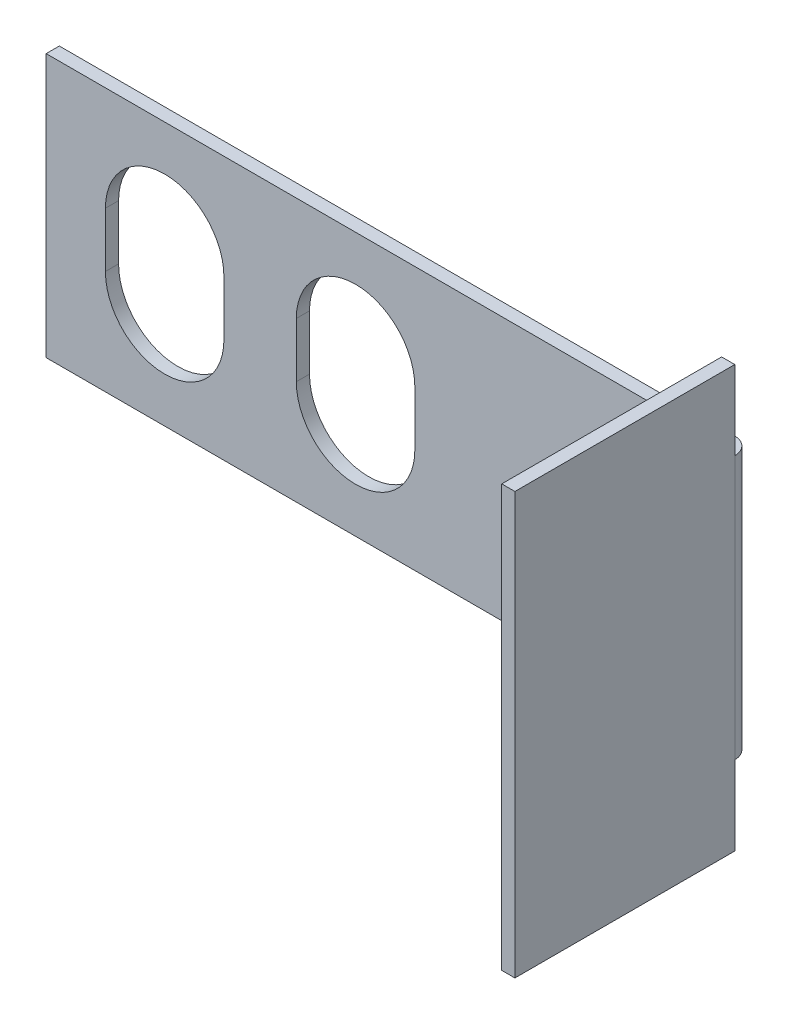
ISO-10303-21;
HEADER;
FILE_DESCRIPTION(('STEP AP214'),'2;1');
FILE_NAME('part.step','',(''),(''),'','','');
FILE_SCHEMA(('AUTOMOTIVE_DESIGN { 1 0 10303 214 1 1 1 1 }'));
ENDSEC;
DATA;
#1=APPLICATION_CONTEXT('core data for automotive mechanical design processes');
#2=APPLICATION_PROTOCOL_DEFINITION('international standard','automotive_design',2000,#1);
#3=PRODUCT_CONTEXT('',#1,'mechanical');
#4=PRODUCT('Part','Part','',(#3));
#5=PRODUCT_RELATED_PRODUCT_CATEGORY('part','',(#4));
#6=PRODUCT_DEFINITION_FORMATION('','',#4);
#7=PRODUCT_DEFINITION_CONTEXT('part definition',#1,'design');
#8=PRODUCT_DEFINITION('design','',#6,#7);
#9=PRODUCT_DEFINITION_SHAPE('','',#8);
#10=(LENGTH_UNIT() NAMED_UNIT(*) SI_UNIT(.MILLI.,.METRE.));
#11=(NAMED_UNIT(*) PLANE_ANGLE_UNIT() SI_UNIT($,.RADIAN.));
#12=(NAMED_UNIT(*) SI_UNIT($,.STERADIAN.) SOLID_ANGLE_UNIT());
#13=UNCERTAINTY_MEASURE_WITH_UNIT(LENGTH_MEASURE(1.E-05),#10,'distance_accuracy_value','');
#14=(GEOMETRIC_REPRESENTATION_CONTEXT(3) GLOBAL_UNCERTAINTY_ASSIGNED_CONTEXT((#13)) GLOBAL_UNIT_ASSIGNED_CONTEXT((#10,
#11,#12)) REPRESENTATION_CONTEXT('',''));
#15=CARTESIAN_POINT('',(0.,0.,0.));
#16=DIRECTION('',(0.,0.,1.));
#17=DIRECTION('',(1.,0.,0.));
#18=AXIS2_PLACEMENT_3D('',#15,#16,#17);
#19=CARTESIAN_POINT('',(0.,5.,-0.5));
#20=DIRECTION('',(0.,1.,0.));
#21=DIRECTION('',(0.,0.,1.));
#22=AXIS2_PLACEMENT_3D('',#19,#20,#21);
#23=PLANE('',#22);
#24=DIRECTION('',(-1.,0.,0.));
#25=VECTOR('',#24,1.);
#26=CARTESIAN_POINT('',(0.,5.,0.));
#27=LINE('',#26,#25);
#28=CARTESIAN_POINT('',(25.65,5.,0.));
#29=VERTEX_POINT('',#28);
#30=CARTESIAN_POINT('',(0.,5.,0.));
#31=VERTEX_POINT('',#30);
#32=EDGE_CURVE('E485',#29,#31,#27,.T.);
#33=ORIENTED_EDGE('',*,*,#32,.F.);
#34=DIRECTION('',(0.,0.,-1.));
#35=VECTOR('',#34,1.);
#36=CARTESIAN_POINT('',(25.65,5.,0.));
#37=LINE('',#36,#35);
#38=CARTESIAN_POINT('',(25.65,5.,-0.500000000000003));
#39=VERTEX_POINT('',#38);
#40=EDGE_CURVE('E455',#29,#39,#37,.T.);
#41=ORIENTED_EDGE('',*,*,#40,.T.);
#42=DIRECTION('',(-1.,0.,0.));
#43=VECTOR('',#42,1.);
#44=CARTESIAN_POINT('',(0.,5.,-0.5));
#45=LINE('',#44,#43);
#46=CARTESIAN_POINT('',(0.,5.,-0.5));
#47=VERTEX_POINT('',#46);
#48=EDGE_CURVE('E488',#39,#47,#45,.T.);
#49=ORIENTED_EDGE('',*,*,#48,.T.);
#50=DIRECTION('',(0.,0.,1.));
#51=VECTOR('',#50,1.);
#52=CARTESIAN_POINT('',(0.,5.,-0.5));
#53=LINE('',#52,#51);
#54=EDGE_CURVE('E14',#47,#31,#53,.T.);
#55=ORIENTED_EDGE('',*,*,#54,.T.);
#56=EDGE_LOOP('',(#33,#41,#49,#55));
#57=FACE_BOUND('',#56,.T.);
#58=ADVANCED_FACE('F210',(#57),#23,.T.);
#59=CARTESIAN_POINT('',(0.,0.,-0.5));
#60=DIRECTION('',(0.,0.,-1.));
#61=DIRECTION('',(-1.,0.,0.));
#62=AXIS2_PLACEMENT_3D('',#59,#60,#61);
#63=PLANE('',#62);
#64=CARTESIAN_POINT('',(4.5,1.04009988451317,-0.500000000000003));
#65=DIRECTION('',(0.,0.,1.));
#66=DIRECTION('',(1.,0.,0.));
#67=AXIS2_PLACEMENT_3D('',#64,#65,#66);
#68=CIRCLE('',#67,2.25);
#69=CARTESIAN_POINT('',(6.75,1.04009988451317,-0.500000000000002));
#70=VERTEX_POINT('',#69);
#71=CARTESIAN_POINT('',(2.25,1.04009988451317,-0.500000000000003));
#72=VERTEX_POINT('',#71);
#73=EDGE_CURVE('E368',#70,#72,#68,.T.);
#74=ORIENTED_EDGE('',*,*,#73,.T.);
#75=DIRECTION('',(0.,1.,0.));
#76=VECTOR('',#75,1.);
#77=CARTESIAN_POINT('',(2.25,-1.04009988451317,-0.500000000000003));
#78=LINE('',#77,#76);
#79=CARTESIAN_POINT('',(2.25,-1.04009988451317,-0.500000000000002));
#80=VERTEX_POINT('',#79);
#81=EDGE_CURVE('E349',#80,#72,#78,.T.);
#82=ORIENTED_EDGE('',*,*,#81,.F.);
#83=CARTESIAN_POINT('',(4.5,-1.04009988451317,-0.500000000000003));
#84=DIRECTION('',(0.,0.,1.));
#85=DIRECTION('',(1.,0.,0.));
#86=AXIS2_PLACEMENT_3D('',#83,#84,#85);
#87=CIRCLE('',#86,2.25);
#88=CARTESIAN_POINT('',(6.75,-1.04009988451317,-0.500000000000002));
#89=VERTEX_POINT('',#88);
#90=EDGE_CURVE('E225',#80,#89,#87,.T.);
#91=ORIENTED_EDGE('',*,*,#90,.T.);
#92=DIRECTION('',(0.,1.,0.));
#93=VECTOR('',#92,1.);
#94=CARTESIAN_POINT('',(6.75,-1.04009988451317,-0.500000000000002));
#95=LINE('',#94,#93);
#96=EDGE_CURVE('E341',#89,#70,#95,.T.);
#97=ORIENTED_EDGE('',*,*,#96,.T.);
#98=EDGE_LOOP('',(#74,#82,#91,#97));
#99=FACE_BOUND('',#98,.T.);
#100=CARTESIAN_POINT('',(11.75,1.04009988451317,-0.500000000000003));
#101=DIRECTION('',(0.,0.,1.));
#102=DIRECTION('',(1.,0.,0.));
#103=AXIS2_PLACEMENT_3D('',#100,#101,#102);
#104=CIRCLE('',#103,2.25);
#105=CARTESIAN_POINT('',(14.,1.04009988451317,-0.500000000000002));
#106=VERTEX_POINT('',#105);
#107=CARTESIAN_POINT('',(9.5,1.04009988451317,-0.500000000000003));
#108=VERTEX_POINT('',#107);
#109=EDGE_CURVE('E409',#106,#108,#104,.T.);
#110=ORIENTED_EDGE('',*,*,#109,.T.);
#111=DIRECTION('',(0.,1.,0.));
#112=VECTOR('',#111,1.);
#113=CARTESIAN_POINT('',(9.5,-1.04009988451317,-0.500000000000003));
#114=LINE('',#113,#112);
#115=CARTESIAN_POINT('',(9.5,-1.04009988451317,-0.5));
#116=VERTEX_POINT('',#115);
#117=EDGE_CURVE('E379',#116,#108,#114,.T.);
#118=ORIENTED_EDGE('',*,*,#117,.F.);
#119=CARTESIAN_POINT('',(11.75,-1.04009988451317,-0.500000000000003));
#120=DIRECTION('',(0.,0.,1.));
#121=DIRECTION('',(1.,0.,0.));
#122=AXIS2_PLACEMENT_3D('',#119,#120,#121);
#123=CIRCLE('',#122,2.25);
#124=CARTESIAN_POINT('',(14.,-1.04009988451317,-0.500000000000002));
#125=VERTEX_POINT('',#124);
#126=EDGE_CURVE('E393',#116,#125,#123,.T.);
#127=ORIENTED_EDGE('',*,*,#126,.T.);
#128=DIRECTION('',(0.,1.,0.));
#129=VECTOR('',#128,1.);
#130=CARTESIAN_POINT('',(14.,-1.04009988451317,-0.500000000000002));
#131=LINE('',#130,#129);
#132=EDGE_CURVE('E375',#125,#106,#131,.T.);
#133=ORIENTED_EDGE('',*,*,#132,.T.);
#134=EDGE_LOOP('',(#110,#118,#127,#133));
#135=FACE_BOUND('',#134,.T.);
#136=ORIENTED_EDGE('',*,*,#48,.F.);
#137=DIRECTION('',(0.,1.,0.));
#138=VECTOR('',#137,1.);
#139=CARTESIAN_POINT('',(25.65,5.,-0.500000000000003));
#140=LINE('',#139,#138);
#141=CARTESIAN_POINT('',(25.65,-5.,-0.5));
#142=VERTEX_POINT('',#141);
#143=EDGE_CURVE('E449',#39,#142,#140,.F.);
#144=ORIENTED_EDGE('',*,*,#143,.T.);
#145=DIRECTION('',(1.,0.,0.));
#146=VECTOR('',#145,1.);
#147=CARTESIAN_POINT('',(0.,-5.,-0.5));
#148=LINE('',#147,#146);
#149=CARTESIAN_POINT('',(0.,-5.,-0.5));
#150=VERTEX_POINT('',#149);
#151=EDGE_CURVE('E484',#150,#142,#148,.T.);
#152=ORIENTED_EDGE('',*,*,#151,.F.);
#153=DIRECTION('',(0.,-1.,0.));
#154=VECTOR('',#153,1.);
#155=CARTESIAN_POINT('',(0.,-5.,-0.5));
#156=LINE('',#155,#154);
#157=EDGE_CURVE('E481',#47,#150,#156,.T.);
#158=ORIENTED_EDGE('',*,*,#157,.F.);
#159=EDGE_LOOP('',(#136,#144,#152,#158));
#160=FACE_BOUND('',#159,.T.);
#161=ADVANCED_FACE('F358',(#99,#135,#160),#63,.T.);
#162=CARTESIAN_POINT('',(0.,0.,0.));
#163=DIRECTION('',(0.,0.,-1.));
#164=DIRECTION('',(-1.,0.,0.));
#165=AXIS2_PLACEMENT_3D('',#162,#163,#164);
#166=PLANE('',#165);
#167=CARTESIAN_POINT('',(4.5,1.04009988451317,0.));
#168=DIRECTION('',(0.,0.,1.));
#169=DIRECTION('',(1.,0.,0.));
#170=AXIS2_PLACEMENT_3D('',#167,#168,#169);
#171=CIRCLE('',#170,2.25);
#172=CARTESIAN_POINT('',(6.75000000000006,1.04009988451317,0.));
#173=VERTEX_POINT('',#172);
#174=CARTESIAN_POINT('',(2.25,1.04009988451317,0.));
#175=VERTEX_POINT('',#174);
#176=EDGE_CURVE('E365',#173,#175,#171,.T.);
#177=ORIENTED_EDGE('',*,*,#176,.F.);
#178=DIRECTION('',(0.,1.,0.));
#179=VECTOR('',#178,1.);
#180=CARTESIAN_POINT('',(6.75000000000006,-1.04009988451317,0.));
#181=LINE('',#180,#179);
#182=CARTESIAN_POINT('',(6.75,-1.04009988451317,0.));
#183=VERTEX_POINT('',#182);
#184=EDGE_CURVE('E350',#183,#173,#181,.T.);
#185=ORIENTED_EDGE('',*,*,#184,.F.);
#186=CARTESIAN_POINT('',(4.5,-1.04009988451317,0.));
#187=DIRECTION('',(0.,0.,1.));
#188=DIRECTION('',(1.,0.,0.));
#189=AXIS2_PLACEMENT_3D('',#186,#187,#188);
#190=CIRCLE('',#189,2.25);
#191=CARTESIAN_POINT('',(2.25000000000006,-1.04009988451317,0.));
#192=VERTEX_POINT('',#191);
#193=EDGE_CURVE('E354',#192,#183,#190,.T.);
#194=ORIENTED_EDGE('',*,*,#193,.F.);
#195=DIRECTION('',(0.,1.,0.));
#196=VECTOR('',#195,1.);
#197=CARTESIAN_POINT('',(2.25,-1.04009988451317,0.));
#198=LINE('',#197,#196);
#199=EDGE_CURVE('E355',#192,#175,#198,.T.);
#200=ORIENTED_EDGE('',*,*,#199,.T.);
#201=EDGE_LOOP('',(#177,#185,#194,#200));
#202=FACE_BOUND('',#201,.T.);
#203=CARTESIAN_POINT('',(11.75,-1.04009988451317,0.));
#204=DIRECTION('',(0.,0.,1.));
#205=DIRECTION('',(1.,0.,0.));
#206=AXIS2_PLACEMENT_3D('',#203,#204,#205);
#207=CIRCLE('',#206,2.25);
#208=CARTESIAN_POINT('',(9.50000000000001,-1.04009988451317,0.));
#209=VERTEX_POINT('',#208);
#210=CARTESIAN_POINT('',(14.,-1.04009988451317,0.));
#211=VERTEX_POINT('',#210);
#212=EDGE_CURVE('E390',#209,#211,#207,.T.);
#213=ORIENTED_EDGE('',*,*,#212,.F.);
#214=DIRECTION('',(0.,1.,0.));
#215=VECTOR('',#214,1.);
#216=CARTESIAN_POINT('',(9.5,-1.04009988451317,0.));
#217=LINE('',#216,#215);
#218=CARTESIAN_POINT('',(9.5,1.04009988451317,0.));
#219=VERTEX_POINT('',#218);
#220=EDGE_CURVE('E382',#209,#219,#217,.T.);
#221=ORIENTED_EDGE('',*,*,#220,.T.);
#222=CARTESIAN_POINT('',(11.75,1.04009988451317,0.));
#223=DIRECTION('',(0.,0.,1.));
#224=DIRECTION('',(1.,0.,0.));
#225=AXIS2_PLACEMENT_3D('',#222,#223,#224);
#226=CIRCLE('',#225,2.25);
#227=CARTESIAN_POINT('',(14.0000000000001,1.04009988451317,0.));
#228=VERTEX_POINT('',#227);
#229=EDGE_CURVE('E405',#228,#219,#226,.T.);
#230=ORIENTED_EDGE('',*,*,#229,.F.);
#231=DIRECTION('',(0.,1.,0.));
#232=VECTOR('',#231,1.);
#233=CARTESIAN_POINT('',(14.0000000000001,-1.04009988451317,0.));
#234=LINE('',#233,#232);
#235=EDGE_CURVE('E372',#211,#228,#234,.T.);
#236=ORIENTED_EDGE('',*,*,#235,.F.);
#237=EDGE_LOOP('',(#213,#221,#230,#236));
#238=FACE_BOUND('',#237,.T.);
#239=DIRECTION('',(0.,1.,0.));
#240=VECTOR('',#239,1.);
#241=CARTESIAN_POINT('',(25.65,5.,0.));
#242=LINE('',#241,#240);
#243=CARTESIAN_POINT('',(25.65,-5.,0.));
#244=VERTEX_POINT('',#243);
#245=EDGE_CURVE('E464',#29,#244,#242,.F.);
#246=ORIENTED_EDGE('',*,*,#245,.F.);
#247=ORIENTED_EDGE('',*,*,#32,.T.);
#248=DIRECTION('',(0.,-1.,0.));
#249=VECTOR('',#248,1.);
#250=CARTESIAN_POINT('',(0.,-5.,0.));
#251=LINE('',#250,#249);
#252=CARTESIAN_POINT('',(0.,-5.,0.));
#253=VERTEX_POINT('',#252);
#254=EDGE_CURVE('E478',#31,#253,#251,.T.);
#255=ORIENTED_EDGE('',*,*,#254,.T.);
#256=DIRECTION('',(1.,0.,0.));
#257=VECTOR('',#256,1.);
#258=CARTESIAN_POINT('',(0.,-5.,0.));
#259=LINE('',#258,#257);
#260=EDGE_CURVE('E492',#253,#244,#259,.T.);
#261=ORIENTED_EDGE('',*,*,#260,.T.);
#262=EDGE_LOOP('',(#246,#247,#255,#261));
#263=FACE_BOUND('',#262,.T.);
#264=ADVANCED_FACE('F499',(#202,#238,#263),#166,.F.);
#265=CARTESIAN_POINT('',(0.,-5.,-0.5));
#266=DIRECTION('',(-1.,0.,0.));
#267=DIRECTION('',(0.,0.,1.));
#268=AXIS2_PLACEMENT_3D('',#265,#266,#267);
#269=PLANE('',#268);
#270=ORIENTED_EDGE('',*,*,#254,.F.);
#271=ORIENTED_EDGE('',*,*,#54,.F.);
#272=ORIENTED_EDGE('',*,*,#157,.T.);
#273=DIRECTION('',(0.,0.,1.));
#274=VECTOR('',#273,1.);
#275=CARTESIAN_POINT('',(0.,-5.,-0.5));
#276=LINE('',#275,#274);
#277=EDGE_CURVE('E214',#150,#253,#276,.T.);
#278=ORIENTED_EDGE('',*,*,#277,.T.);
#279=EDGE_LOOP('',(#270,#271,#272,#278));
#280=FACE_BOUND('',#279,.T.);
#281=ADVANCED_FACE('F212',(#280),#269,.T.);
#282=CARTESIAN_POINT('',(0.,-5.,-0.5));
#283=DIRECTION('',(0.,-1.,0.));
#284=DIRECTION('',(0.,0.,-1.));
#285=AXIS2_PLACEMENT_3D('',#282,#283,#284);
#286=PLANE('',#285);
#287=DIRECTION('',(0.,0.,-1.));
#288=VECTOR('',#287,1.);
#289=CARTESIAN_POINT('',(25.65,-5.,0.));
#290=LINE('',#289,#288);
#291=EDGE_CURVE('E470',#244,#142,#290,.T.);
#292=ORIENTED_EDGE('',*,*,#291,.F.);
#293=ORIENTED_EDGE('',*,*,#260,.F.);
#294=ORIENTED_EDGE('',*,*,#277,.F.);
#295=ORIENTED_EDGE('',*,*,#151,.T.);
#296=EDGE_LOOP('',(#292,#293,#294,#295));
#297=FACE_BOUND('',#296,.T.);
#298=ADVANCED_FACE('F510',(#297),#286,.T.);
#299=CARTESIAN_POINT('',(25.65,-5.,0.149999999999998));
#300=DIRECTION('',(0.,-1.,0.));
#301=DIRECTION('',(0.,0.,-1.));
#302=AXIS2_PLACEMENT_3D('',#299,#300,#301);
#303=PLANE('',#302);
#304=DIRECTION('',(1.,0.,0.));
#305=VECTOR('',#304,1.);
#306=CARTESIAN_POINT('',(25.8,-5.,0.149999999999997));
#307=LINE('',#306,#305);
#308=CARTESIAN_POINT('',(25.8,-5.,0.149999999999997));
#309=VERTEX_POINT('',#308);
#310=CARTESIAN_POINT('',(26.3,-5.,0.149999999999995));
#311=VERTEX_POINT('',#310);
#312=EDGE_CURVE('E473',#309,#311,#307,.T.);
#313=ORIENTED_EDGE('',*,*,#312,.F.);
#314=CARTESIAN_POINT('',(25.65,-5.,0.149999999999998));
#315=DIRECTION('',(0.,1.,0.));
#316=DIRECTION('',(0.,0.,1.));
#317=AXIS2_PLACEMENT_3D('',#314,#315,#316);
#318=CIRCLE('',#317,0.150000000000001);
#319=EDGE_CURVE('E459',#244,#309,#318,.F.);
#320=ORIENTED_EDGE('',*,*,#319,.F.);
#321=ORIENTED_EDGE('',*,*,#291,.T.);
#322=CARTESIAN_POINT('',(25.65,-5.,0.149999999999998));
#323=DIRECTION('',(0.,1.,0.));
#324=DIRECTION('',(0.,0.,1.));
#325=AXIS2_PLACEMENT_3D('',#322,#323,#324);
#326=CIRCLE('',#325,0.650000000000001);
#327=EDGE_CURVE('E452',#142,#311,#326,.F.);
#328=ORIENTED_EDGE('',*,*,#327,.T.);
#329=EDGE_LOOP('',(#313,#320,#321,#328));
#330=FACE_BOUND('',#329,.T.);
#331=ADVANCED_FACE('F513',(#330),#303,.T.);
#332=CARTESIAN_POINT('',(25.65,5.,0.149999999999998));
#333=DIRECTION('',(0.,-1.,0.));
#334=DIRECTION('',(0.,0.,-1.));
#335=AXIS2_PLACEMENT_3D('',#332,#333,#334);
#336=PLANE('',#335);
#337=CARTESIAN_POINT('',(25.65,5.,0.149999999999998));
#338=DIRECTION('',(0.,1.,0.));
#339=DIRECTION('',(0.,0.,1.));
#340=AXIS2_PLACEMENT_3D('',#337,#338,#339);
#341=CIRCLE('',#340,0.150000000000001);
#342=CARTESIAN_POINT('',(25.8,5.,0.149999999999997));
#343=VERTEX_POINT('',#342);
#344=EDGE_CURVE('E466',#343,#29,#341,.T.);
#345=ORIENTED_EDGE('',*,*,#344,.F.);
#346=DIRECTION('',(1.,0.,0.));
#347=VECTOR('',#346,1.);
#348=CARTESIAN_POINT('',(25.8,5.,0.149999999999997));
#349=LINE('',#348,#347);
#350=CARTESIAN_POINT('',(26.3,5.,0.149999999999996));
#351=VERTEX_POINT('',#350);
#352=EDGE_CURVE('E476',#343,#351,#349,.T.);
#353=ORIENTED_EDGE('',*,*,#352,.T.);
#354=CARTESIAN_POINT('',(25.65,5.,0.149999999999998));
#355=DIRECTION('',(0.,1.,0.));
#356=DIRECTION('',(0.,0.,1.));
#357=AXIS2_PLACEMENT_3D('',#354,#355,#356);
#358=CIRCLE('',#357,0.650000000000001);
#359=EDGE_CURVE('E453',#351,#39,#358,.T.);
#360=ORIENTED_EDGE('',*,*,#359,.T.);
#361=ORIENTED_EDGE('',*,*,#40,.F.);
#362=EDGE_LOOP('',(#345,#353,#360,#361));
#363=FACE_BOUND('',#362,.T.);
#364=ADVANCED_FACE('F521',(#363),#336,.F.);
#365=CARTESIAN_POINT('',(25.65,5.,0.149999999999998));
#366=DIRECTION('',(0.,1.,0.));
#367=DIRECTION('',(1.,0.,0.));
#368=AXIS2_PLACEMENT_3D('',#365,#366,#367);
#369=CYLINDRICAL_SURFACE('',#368,0.650000000000001);
#370=ORIENTED_EDGE('',*,*,#143,.F.);
#371=ORIENTED_EDGE('',*,*,#359,.F.);
#372=DIRECTION('',(0.,1.,0.));
#373=VECTOR('',#372,1.);
#374=CARTESIAN_POINT('',(26.3,5.,0.149999999999996));
#375=LINE('',#374,#373);
#376=EDGE_CURVE('E456',#311,#351,#375,.T.);
#377=ORIENTED_EDGE('',*,*,#376,.F.);
#378=ORIENTED_EDGE('',*,*,#327,.F.);
#379=EDGE_LOOP('',(#370,#371,#377,#378));
#380=FACE_BOUND('',#379,.T.);
#381=ADVANCED_FACE('F518',(#380),#369,.T.);
#382=CARTESIAN_POINT('',(25.65,5.,0.149999999999998));
#383=DIRECTION('',(0.,1.,0.));
#384=DIRECTION('',(1.,0.,0.));
#385=AXIS2_PLACEMENT_3D('',#382,#383,#384);
#386=CYLINDRICAL_SURFACE('',#385,0.150000000000001);
#387=ORIENTED_EDGE('',*,*,#245,.T.);
#388=ORIENTED_EDGE('',*,*,#319,.T.);
#389=DIRECTION('',(0.,1.,0.));
#390=VECTOR('',#389,1.);
#391=CARTESIAN_POINT('',(25.8,5.,0.149999999999997));
#392=LINE('',#391,#390);
#393=EDGE_CURVE('E419',#309,#343,#392,.T.);
#394=ORIENTED_EDGE('',*,*,#393,.T.);
#395=ORIENTED_EDGE('',*,*,#344,.T.);
#396=EDGE_LOOP('',(#387,#388,#394,#395));
#397=FACE_BOUND('',#396,.T.);
#398=ADVANCED_FACE('F550',(#397),#386,.F.);
#399=CARTESIAN_POINT('',(25.8,-8.,0.149999999999997));
#400=DIRECTION('',(0.,0.,-1.));
#401=DIRECTION('',(-1.,0.,0.));
#402=AXIS2_PLACEMENT_3D('',#399,#400,#401);
#403=PLANE('',#402);
#404=ORIENTED_EDGE('',*,*,#352,.F.);
#405=DIRECTION('',(0.,1.,0.));
#406=VECTOR('',#405,1.);
#407=CARTESIAN_POINT('',(25.8,-8.,0.149999999999997));
#408=LINE('',#407,#406);
#409=CARTESIAN_POINT('',(25.8,8.,0.149999999999997));
#410=VERTEX_POINT('',#409);
#411=EDGE_CURVE('E446',#343,#410,#408,.T.);
#412=ORIENTED_EDGE('',*,*,#411,.T.);
#413=DIRECTION('',(-1.,0.,0.));
#414=VECTOR('',#413,1.);
#415=CARTESIAN_POINT('',(25.8,8.,0.149999999999997));
#416=LINE('',#415,#414);
#417=CARTESIAN_POINT('',(26.3,8.,0.149999999999995));
#418=VERTEX_POINT('',#417);
#419=EDGE_CURVE('E441',#410,#418,#416,.F.);
#420=ORIENTED_EDGE('',*,*,#419,.T.);
#421=DIRECTION('',(0.,1.,0.));
#422=VECTOR('',#421,1.);
#423=CARTESIAN_POINT('',(26.3,-8.,0.149999999999995));
#424=LINE('',#423,#422);
#425=EDGE_CURVE('E437',#418,#351,#424,.F.);
#426=ORIENTED_EDGE('',*,*,#425,.T.);
#427=EDGE_LOOP('',(#404,#412,#420,#426));
#428=FACE_BOUND('',#427,.T.);
#429=ADVANCED_FACE('F525',(#428),#403,.T.);
#430=CARTESIAN_POINT('',(26.3,8.,8.5));
#431=DIRECTION('',(0.,-1.,0.));
#432=DIRECTION('',(0.,0.,-1.));
#433=AXIS2_PLACEMENT_3D('',#430,#431,#432);
#434=PLANE('',#433);
#435=ORIENTED_EDGE('',*,*,#419,.F.);
#436=DIRECTION('',(0.,0.,-1.));
#437=VECTOR('',#436,1.);
#438=CARTESIAN_POINT('',(25.8,8.,8.5));
#439=LINE('',#438,#437);
#440=CARTESIAN_POINT('',(25.8,8.,8.5));
#441=VERTEX_POINT('',#440);
#442=EDGE_CURVE('E435',#410,#441,#439,.F.);
#443=ORIENTED_EDGE('',*,*,#442,.T.);
#444=DIRECTION('',(-1.,0.,0.));
#445=VECTOR('',#444,1.);
#446=CARTESIAN_POINT('',(26.3,8.,8.5));
#447=LINE('',#446,#445);
#448=CARTESIAN_POINT('',(26.3,8.,8.5));
#449=VERTEX_POINT('',#448);
#450=EDGE_CURVE('E416',#449,#441,#447,.T.);
#451=ORIENTED_EDGE('',*,*,#450,.F.);
#452=DIRECTION('',(0.,0.,1.));
#453=VECTOR('',#452,1.);
#454=CARTESIAN_POINT('',(26.3,8.,0.));
#455=LINE('',#454,#453);
#456=EDGE_CURVE('E428',#418,#449,#455,.T.);
#457=ORIENTED_EDGE('',*,*,#456,.F.);
#458=EDGE_LOOP('',(#435,#443,#451,#457));
#459=FACE_BOUND('',#458,.T.);
#460=ADVANCED_FACE('F537',(#459),#434,.F.);
#461=CARTESIAN_POINT('',(26.3,-8.,0.));
#462=DIRECTION('',(0.,1.,0.));
#463=DIRECTION('',(0.,0.,1.));
#464=AXIS2_PLACEMENT_3D('',#461,#462,#463);
#465=PLANE('',#464);
#466=DIRECTION('',(-1.,0.,0.));
#467=VECTOR('',#466,1.);
#468=CARTESIAN_POINT('',(26.3,-8.,0.149999999999995));
#469=LINE('',#468,#467);
#470=CARTESIAN_POINT('',(25.8,-8.,0.149999999999997));
#471=VERTEX_POINT('',#470);
#472=CARTESIAN_POINT('',(26.3,-8.,0.149999999999995));
#473=VERTEX_POINT('',#472);
#474=EDGE_CURVE('E415',#471,#473,#469,.F.);
#475=ORIENTED_EDGE('',*,*,#474,.T.);
#476=DIRECTION('',(0.,0.,-1.));
#477=VECTOR('',#476,1.);
#478=CARTESIAN_POINT('',(26.3,-8.,0.));
#479=LINE('',#478,#477);
#480=CARTESIAN_POINT('',(26.3,-8.,8.5));
#481=VERTEX_POINT('',#480);
#482=EDGE_CURVE('E423',#481,#473,#479,.T.);
#483=ORIENTED_EDGE('',*,*,#482,.F.);
#484=DIRECTION('',(-1.,0.,0.));
#485=VECTOR('',#484,1.);
#486=CARTESIAN_POINT('',(26.3,-8.,8.5));
#487=LINE('',#486,#485);
#488=CARTESIAN_POINT('',(25.8,-8.,8.5));
#489=VERTEX_POINT('',#488);
#490=EDGE_CURVE('E420',#481,#489,#487,.T.);
#491=ORIENTED_EDGE('',*,*,#490,.T.);
#492=DIRECTION('',(0.,0.,1.));
#493=VECTOR('',#492,1.);
#494=CARTESIAN_POINT('',(25.8,-8.,0.));
#495=LINE('',#494,#493);
#496=EDGE_CURVE('E430',#489,#471,#495,.F.);
#497=ORIENTED_EDGE('',*,*,#496,.T.);
#498=EDGE_LOOP('',(#475,#483,#491,#497));
#499=FACE_BOUND('',#498,.T.);
#500=ADVANCED_FACE('F609',(#499),#465,.F.);
#501=CARTESIAN_POINT('',(26.3,0.,0.));
#502=DIRECTION('',(-1.,0.,0.));
#503=DIRECTION('',(0.,0.,1.));
#504=AXIS2_PLACEMENT_3D('',#501,#502,#503);
#505=PLANE('',#504);
#506=ORIENTED_EDGE('',*,*,#425,.F.);
#507=ORIENTED_EDGE('',*,*,#456,.T.);
#508=DIRECTION('',(0.,-1.,0.));
#509=VECTOR('',#508,1.);
#510=CARTESIAN_POINT('',(26.3,0.,8.5));
#511=LINE('',#510,#509);
#512=EDGE_CURVE('E426',#449,#481,#511,.T.);
#513=ORIENTED_EDGE('',*,*,#512,.T.);
#514=ORIENTED_EDGE('',*,*,#482,.T.);
#515=EDGE_CURVE('E440',#311,#473,#424,.F.);
#516=ORIENTED_EDGE('',*,*,#515,.F.);
#517=ORIENTED_EDGE('',*,*,#376,.T.);
#518=EDGE_LOOP('',(#506,#507,#513,#514,#516,#517));
#519=FACE_BOUND('',#518,.T.);
#520=ADVANCED_FACE('F545',(#519),#505,.F.);
#521=CARTESIAN_POINT('',(25.8,0.,0.));
#522=DIRECTION('',(-1.,0.,0.));
#523=DIRECTION('',(0.,0.,1.));
#524=AXIS2_PLACEMENT_3D('',#521,#522,#523);
#525=PLANE('',#524);
#526=ORIENTED_EDGE('',*,*,#442,.F.);
#527=ORIENTED_EDGE('',*,*,#411,.F.);
#528=ORIENTED_EDGE('',*,*,#393,.F.);
#529=EDGE_CURVE('E443',#471,#309,#408,.T.);
#530=ORIENTED_EDGE('',*,*,#529,.F.);
#531=ORIENTED_EDGE('',*,*,#496,.F.);
#532=DIRECTION('',(0.,1.,0.));
#533=VECTOR('',#532,1.);
#534=CARTESIAN_POINT('',(25.8,-8.,8.5));
#535=LINE('',#534,#533);
#536=EDGE_CURVE('E433',#441,#489,#535,.F.);
#537=ORIENTED_EDGE('',*,*,#536,.F.);
#538=EDGE_LOOP('',(#526,#527,#528,#530,#531,#537));
#539=FACE_BOUND('',#538,.T.);
#540=ADVANCED_FACE('F531',(#539),#525,.T.);
#541=CARTESIAN_POINT('',(26.3,-8.,8.5));
#542=DIRECTION('',(0.,0.,-1.));
#543=DIRECTION('',(-1.,0.,0.));
#544=AXIS2_PLACEMENT_3D('',#541,#542,#543);
#545=PLANE('',#544);
#546=ORIENTED_EDGE('',*,*,#536,.T.);
#547=ORIENTED_EDGE('',*,*,#490,.F.);
#548=ORIENTED_EDGE('',*,*,#512,.F.);
#549=ORIENTED_EDGE('',*,*,#450,.T.);
#550=EDGE_LOOP('',(#546,#547,#548,#549));
#551=FACE_BOUND('',#550,.T.);
#552=ADVANCED_FACE('F541',(#551),#545,.F.);
#553=ORIENTED_EDGE('',*,*,#529,.T.);
#554=ORIENTED_EDGE('',*,*,#312,.T.);
#555=ORIENTED_EDGE('',*,*,#515,.T.);
#556=ORIENTED_EDGE('',*,*,#474,.F.);
#557=EDGE_LOOP('',(#553,#554,#555,#556));
#558=FACE_BOUND('',#557,.T.);
#559=ADVANCED_FACE('F548',(#558),#403,.T.);
#560=CARTESIAN_POINT('',(11.75,1.04009988451317,0.));
#561=DIRECTION('',(0.,0.,1.));
#562=DIRECTION('',(1.,0.,0.));
#563=AXIS2_PLACEMENT_3D('',#560,#561,#562);
#564=CYLINDRICAL_SURFACE('',#563,2.25);
#565=ORIENTED_EDGE('',*,*,#109,.F.);
#566=DIRECTION('',(0.,0.,-1.));
#567=VECTOR('',#566,1.);
#568=CARTESIAN_POINT('',(14.,1.04009988451317,-0.500000000000003));
#569=LINE('',#568,#567);
#570=EDGE_CURVE('E401',#228,#106,#569,.T.);
#571=ORIENTED_EDGE('',*,*,#570,.F.);
#572=ORIENTED_EDGE('',*,*,#229,.T.);
#573=DIRECTION('',(0.,0.,1.));
#574=VECTOR('',#573,1.);
#575=CARTESIAN_POINT('',(9.5,1.04009988451317,0.));
#576=LINE('',#575,#574);
#577=EDGE_CURVE('E413',#108,#219,#576,.T.);
#578=ORIENTED_EDGE('',*,*,#577,.F.);
#579=EDGE_LOOP('',(#565,#571,#572,#578));
#580=FACE_BOUND('',#579,.T.);
#581=ADVANCED_FACE('F598',(#580),#564,.F.);
#582=CARTESIAN_POINT('',(11.75,-1.04009988451317,0.));
#583=DIRECTION('',(0.,0.,1.));
#584=DIRECTION('',(1.,0.,0.));
#585=AXIS2_PLACEMENT_3D('',#582,#583,#584);
#586=CYLINDRICAL_SURFACE('',#585,2.25);
#587=ORIENTED_EDGE('',*,*,#212,.T.);
#588=DIRECTION('',(0.,0.,-1.));
#589=VECTOR('',#588,1.);
#590=CARTESIAN_POINT('',(14.,-1.04009988451317,-0.500000000000003));
#591=LINE('',#590,#589);
#592=EDGE_CURVE('E386',#211,#125,#591,.T.);
#593=ORIENTED_EDGE('',*,*,#592,.T.);
#594=ORIENTED_EDGE('',*,*,#126,.F.);
#595=DIRECTION('',(0.,0.,1.));
#596=VECTOR('',#595,1.);
#597=CARTESIAN_POINT('',(9.5,-1.04009988451317,0.));
#598=LINE('',#597,#596);
#599=EDGE_CURVE('E397',#209,#116,#598,.F.);
#600=ORIENTED_EDGE('',*,*,#599,.F.);
#601=EDGE_LOOP('',(#587,#593,#594,#600));
#602=FACE_BOUND('',#601,.T.);
#603=ADVANCED_FACE('F589',(#602),#586,.F.);
#604=CARTESIAN_POINT('',(9.5,-1.04009988451317,0.));
#605=DIRECTION('',(-1.,0.,0.));
#606=DIRECTION('',(0.,0.,1.));
#607=AXIS2_PLACEMENT_3D('',#604,#605,#606);
#608=PLANE('',#607);
#609=ORIENTED_EDGE('',*,*,#577,.T.);
#610=ORIENTED_EDGE('',*,*,#220,.F.);
#611=ORIENTED_EDGE('',*,*,#599,.T.);
#612=ORIENTED_EDGE('',*,*,#117,.T.);
#613=EDGE_LOOP('',(#609,#610,#611,#612));
#614=FACE_BOUND('',#613,.T.);
#615=ADVANCED_FACE('F595',(#614),#608,.F.);
#616=CARTESIAN_POINT('',(14.,-1.04009988451317,-0.500000000000003));
#617=DIRECTION('',(1.,0.,0.));
#618=DIRECTION('',(0.,0.,-1.));
#619=AXIS2_PLACEMENT_3D('',#616,#617,#618);
#620=PLANE('',#619);
#621=ORIENTED_EDGE('',*,*,#570,.T.);
#622=ORIENTED_EDGE('',*,*,#132,.F.);
#623=ORIENTED_EDGE('',*,*,#592,.F.);
#624=ORIENTED_EDGE('',*,*,#235,.T.);
#625=EDGE_LOOP('',(#621,#622,#623,#624));
#626=FACE_BOUND('',#625,.T.);
#627=ADVANCED_FACE('F591',(#626),#620,.F.);
#628=CARTESIAN_POINT('',(4.5,1.04009988451317,0.));
#629=DIRECTION('',(0.,0.,1.));
#630=DIRECTION('',(1.,0.,0.));
#631=AXIS2_PLACEMENT_3D('',#628,#629,#630);
#632=CYLINDRICAL_SURFACE('',#631,2.25);
#633=ORIENTED_EDGE('',*,*,#73,.F.);
#634=DIRECTION('',(0.,0.,-1.));
#635=VECTOR('',#634,1.);
#636=CARTESIAN_POINT('',(6.75,1.04009988451317,-0.500000000000003));
#637=LINE('',#636,#635);
#638=EDGE_CURVE('E346',#173,#70,#637,.T.);
#639=ORIENTED_EDGE('',*,*,#638,.F.);
#640=ORIENTED_EDGE('',*,*,#176,.T.);
#641=DIRECTION('',(0.,0.,1.));
#642=VECTOR('',#641,1.);
#643=CARTESIAN_POINT('',(2.25,1.04009988451317,0.));
#644=LINE('',#643,#642);
#645=EDGE_CURVE('E370',#72,#175,#644,.T.);
#646=ORIENTED_EDGE('',*,*,#645,.F.);
#647=EDGE_LOOP('',(#633,#639,#640,#646));
#648=FACE_BOUND('',#647,.T.);
#649=ADVANCED_FACE('F758',(#648),#632,.F.);
#650=CARTESIAN_POINT('',(4.5,-1.04009988451317,0.));
#651=DIRECTION('',(0.,0.,1.));
#652=DIRECTION('',(1.,0.,0.));
#653=AXIS2_PLACEMENT_3D('',#650,#651,#652);
#654=CYLINDRICAL_SURFACE('',#653,2.25);
#655=ORIENTED_EDGE('',*,*,#193,.T.);
#656=DIRECTION('',(0.,0.,-1.));
#657=VECTOR('',#656,1.);
#658=CARTESIAN_POINT('',(6.75,-1.04009988451317,-0.500000000000003));
#659=LINE('',#658,#657);
#660=EDGE_CURVE('E343',#183,#89,#659,.T.);
#661=ORIENTED_EDGE('',*,*,#660,.T.);
#662=ORIENTED_EDGE('',*,*,#90,.F.);
#663=DIRECTION('',(0.,0.,1.));
#664=VECTOR('',#663,1.);
#665=CARTESIAN_POINT('',(2.25,-1.04009988451317,0.));
#666=LINE('',#665,#664);
#667=EDGE_CURVE('E229',#192,#80,#666,.F.);
#668=ORIENTED_EDGE('',*,*,#667,.F.);
#669=EDGE_LOOP('',(#655,#661,#662,#668));
#670=FACE_BOUND('',#669,.T.);
#671=ADVANCED_FACE('F352',(#670),#654,.F.);
#672=CARTESIAN_POINT('',(2.25,-1.04009988451317,0.));
#673=DIRECTION('',(-1.,0.,0.));
#674=DIRECTION('',(0.,0.,1.));
#675=AXIS2_PLACEMENT_3D('',#672,#673,#674);
#676=PLANE('',#675);
#677=ORIENTED_EDGE('',*,*,#645,.T.);
#678=ORIENTED_EDGE('',*,*,#199,.F.);
#679=ORIENTED_EDGE('',*,*,#667,.T.);
#680=ORIENTED_EDGE('',*,*,#81,.T.);
#681=EDGE_LOOP('',(#677,#678,#679,#680));
#682=FACE_BOUND('',#681,.T.);
#683=ADVANCED_FACE('F774',(#682),#676,.F.);
#684=CARTESIAN_POINT('',(6.75,-1.04009988451317,-0.500000000000003));
#685=DIRECTION('',(1.,0.,0.));
#686=DIRECTION('',(0.,0.,-1.));
#687=AXIS2_PLACEMENT_3D('',#684,#685,#686);
#688=PLANE('',#687);
#689=ORIENTED_EDGE('',*,*,#638,.T.);
#690=ORIENTED_EDGE('',*,*,#96,.F.);
#691=ORIENTED_EDGE('',*,*,#660,.F.);
#692=ORIENTED_EDGE('',*,*,#184,.T.);
#693=EDGE_LOOP('',(#689,#690,#691,#692));
#694=FACE_BOUND('',#693,.T.);
#695=ADVANCED_FACE('F342',(#694),#688,.F.);
#696=CLOSED_SHELL('',(#58,#161,#264,#281,#298,#331,#364,#381,#398,#429,#460,#500,#520,#540,#552,
#559,#581,#603,#615,#627,#649,#671,#683,#695));
#697=MANIFOLD_SOLID_BREP('B2',#696);
#698=ADVANCED_BREP_SHAPE_REPRESENTATION('',(#18,#697),#14);
#699=SHAPE_DEFINITION_REPRESENTATION(#9,#698);
ENDSEC;
END-ISO-10303-21;
